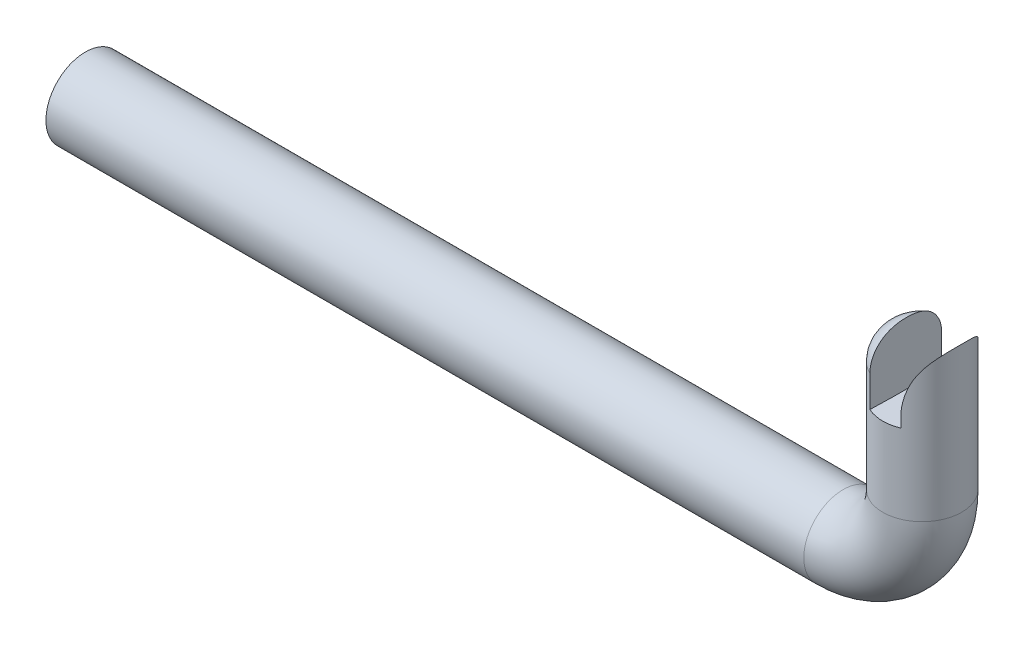
ISO-10303-21;
HEADER;
FILE_DESCRIPTION(('STEP AP214'),'2;1');
FILE_NAME('part.step','',(''),(''),'','','');
FILE_SCHEMA(('AUTOMOTIVE_DESIGN { 1 0 10303 214 1 1 1 1 }'));
ENDSEC;
DATA;
#1=APPLICATION_CONTEXT('core data for automotive mechanical design processes');
#2=APPLICATION_PROTOCOL_DEFINITION('international standard','automotive_design',2000,#1);
#3=PRODUCT_CONTEXT('',#1,'mechanical');
#4=PRODUCT('Part','Part','',(#3));
#5=PRODUCT_RELATED_PRODUCT_CATEGORY('part','',(#4));
#6=PRODUCT_DEFINITION_FORMATION('','',#4);
#7=PRODUCT_DEFINITION_CONTEXT('part definition',#1,'design');
#8=PRODUCT_DEFINITION('design','',#6,#7);
#9=PRODUCT_DEFINITION_SHAPE('','',#8);
#10=(LENGTH_UNIT() NAMED_UNIT(*) SI_UNIT(.MILLI.,.METRE.));
#11=(NAMED_UNIT(*) PLANE_ANGLE_UNIT() SI_UNIT($,.RADIAN.));
#12=(NAMED_UNIT(*) SI_UNIT($,.STERADIAN.) SOLID_ANGLE_UNIT());
#13=UNCERTAINTY_MEASURE_WITH_UNIT(LENGTH_MEASURE(1.E-05),#10,'distance_accuracy_value','');
#14=(GEOMETRIC_REPRESENTATION_CONTEXT(3) GLOBAL_UNCERTAINTY_ASSIGNED_CONTEXT((#13)) GLOBAL_UNIT_ASSIGNED_CONTEXT((#10,
#11,#12)) REPRESENTATION_CONTEXT('',''));
#15=CARTESIAN_POINT('',(0.,0.,0.));
#16=DIRECTION('',(0.,0.,1.));
#17=DIRECTION('',(1.,0.,0.));
#18=AXIS2_PLACEMENT_3D('',#15,#16,#17);
#19=CARTESIAN_POINT('',(67.31,12.7,0.));
#20=DIRECTION('',(0.,1.,0.));
#21=DIRECTION('',(0.,0.,-1.));
#22=AXIS2_PLACEMENT_3D('',#19,#20,#21);
#23=PLANE('',#22);
#24=CARTESIAN_POINT('',(67.31,12.7,0.));
#25=DIRECTION('',(0.,1.,0.));
#26=DIRECTION('',(0.,0.,-1.));
#27=AXIS2_PLACEMENT_3D('',#24,#25,#26);
#28=CIRCLE('',#27,3.175);
#29=CARTESIAN_POINT('',(65.9894886363636,12.7,2.88736467016328));
#30=VERTEX_POINT('',#29);
#31=CARTESIAN_POINT('',(68.5294886363636,12.7,2.93146251311185));
#32=VERTEX_POINT('',#31);
#33=EDGE_CURVE('E89',#30,#32,#28,.T.);
#34=ORIENTED_EDGE('',*,*,#33,.T.);
#35=CARTESIAN_POINT('',(-16.51,12.7,0.));
#36=DIRECTION('',(0.,-1.,0.));
#37=DIRECTION('',(0.,0.,-1.));
#38=AXIS2_PLACEMENT_3D('',#35,#36,#37);
#39=CIRCLE('',#38,85.09);
#40=CARTESIAN_POINT('',(68.5294886363636,12.7,-2.93146251311182));
#41=VERTEX_POINT('',#40);
#42=EDGE_CURVE('E93',#41,#32,#39,.T.);
#43=ORIENTED_EDGE('',*,*,#42,.F.);
#44=CARTESIAN_POINT('',(67.31,12.7,-3.175));
#45=VERTEX_POINT('',#44);
#46=EDGE_CURVE('E79',#41,#45,#28,.T.);
#47=ORIENTED_EDGE('',*,*,#46,.T.);
#48=CARTESIAN_POINT('',(65.9894886363636,12.7,-2.88736467016325));
#49=VERTEX_POINT('',#48);
#50=EDGE_CURVE('E87',#45,#49,#28,.T.);
#51=ORIENTED_EDGE('',*,*,#50,.T.);
#52=CARTESIAN_POINT('',(-16.51,12.7,0.));
#53=DIRECTION('',(0.,1.,0.));
#54=DIRECTION('',(0.,0.,1.));
#55=AXIS2_PLACEMENT_3D('',#52,#53,#54);
#56=CIRCLE('',#55,82.55);
#57=EDGE_CURVE('E109',#30,#49,#56,.T.);
#58=ORIENTED_EDGE('',*,*,#57,.F.);
#59=EDGE_LOOP('',(#34,#43,#47,#51,#58));
#60=FACE_BOUND('',#59,.T.);
#61=ADVANCED_FACE('F34',(#60),#23,.T.);
#62=CARTESIAN_POINT('',(0.,0.,0.));
#63=DIRECTION('',(1.,0.,0.));
#64=DIRECTION('',(0.,0.,-1.));
#65=AXIS2_PLACEMENT_3D('',#62,#63,#64);
#66=PLANE('',#65);
#67=CARTESIAN_POINT('',(0.,0.,0.));
#68=DIRECTION('',(1.,0.,0.));
#69=DIRECTION('',(0.,0.,-1.));
#70=AXIS2_PLACEMENT_3D('',#67,#68,#69);
#71=CIRCLE('',#70,3.175);
#72=CARTESIAN_POINT('',(0.,0.,-3.175));
#73=VERTEX_POINT('',#72);
#74=EDGE_CURVE('E116',#73,#73,#71,.T.);
#75=ORIENTED_EDGE('',*,*,#74,.F.);
#76=EDGE_LOOP('',(#75));
#77=FACE_BOUND('',#76,.T.);
#78=ADVANCED_FACE('F133',(#77),#66,.F.);
#79=CARTESIAN_POINT('',(0.,0.,0.));
#80=DIRECTION('',(1.,0.,0.));
#81=DIRECTION('',(0.,0.,-1.));
#82=AXIS2_PLACEMENT_3D('',#79,#80,#81);
#83=CYLINDRICAL_SURFACE('',#82,3.175);
#84=CARTESIAN_POINT('',(60.96,0.,0.));
#85=DIRECTION('',(1.,0.,0.));
#86=DIRECTION('',(0.,0.,-1.));
#87=AXIS2_PLACEMENT_3D('',#84,#85,#86);
#88=CIRCLE('',#87,3.175);
#89=CARTESIAN_POINT('',(60.96,-3.175,0.));
#90=VERTEX_POINT('',#89);
#91=EDGE_CURVE('E119',#90,#90,#88,.T.);
#92=ORIENTED_EDGE('',*,*,#91,.F.);
#93=EDGE_LOOP('',(#92));
#94=FACE_BOUND('',#93,.T.);
#95=ORIENTED_EDGE('',*,*,#74,.T.);
#96=EDGE_LOOP('',(#95));
#97=FACE_BOUND('',#96,.T.);
#98=ADVANCED_FACE('F135',(#94,#97),#83,.T.);
#99=CARTESIAN_POINT('',(60.96,6.35,0.));
#100=DIRECTION('',(0.,0.,1.));
#101=DIRECTION('',(1.,0.,0.));
#102=AXIS2_PLACEMENT_3D('',#99,#100,#101);
#103=TOROIDAL_SURFACE('',#102,6.35,3.175);
#104=CARTESIAN_POINT('',(67.31,6.35,0.));
#105=DIRECTION('',(0.,1.,0.));
#106=DIRECTION('',(0.,0.,-1.));
#107=AXIS2_PLACEMENT_3D('',#104,#105,#106);
#108=CIRCLE('',#107,3.175);
#109=CARTESIAN_POINT('',(70.485,6.35,0.));
#110=VERTEX_POINT('',#109);
#111=EDGE_CURVE('E90',#110,#110,#108,.T.);
#112=CARTESIAN_POINT('',(60.96,6.35,0.));
#113=DIRECTION('',(0.,0.,1.));
#114=DIRECTION('',(1.,0.,0.));
#115=AXIS2_PLACEMENT_3D('',#112,#113,#114);
#116=CIRCLE('',#115,9.525);
#117=EDGE_CURVE('',#90,#110,#116,.T.);
#118=ORIENTED_EDGE('',*,*,#91,.T.);
#119=ORIENTED_EDGE('',*,*,#111,.F.);
#120=ORIENTED_EDGE('',*,*,#117,.T.);
#121=ORIENTED_EDGE('',*,*,#117,.F.);
#122=EDGE_LOOP('',(#118,#120,#119,#121));
#123=FACE_BOUND('',#122,.T.);
#124=ADVANCED_FACE('F138',(#123),#103,.T.);
#125=CARTESIAN_POINT('',(67.31,6.35,0.));
#126=DIRECTION('',(0.,1.,0.));
#127=DIRECTION('',(0.,0.,1.));
#128=AXIS2_PLACEMENT_3D('',#125,#126,#127);
#129=CYLINDRICAL_SURFACE('',#128,3.175);
#130=DIRECTION('',(0.,-1.,0.));
#131=VECTOR('',#130,1.);
#132=CARTESIAN_POINT('',(65.9894886363636,17.78,2.88736467016325));
#133=LINE('',#132,#131);
#134=CARTESIAN_POINT('',(65.9894886363636,15.24,2.88736467016325));
#135=VERTEX_POINT('',#134);
#136=EDGE_CURVE('E112',#135,#30,#133,.T.);
#137=ORIENTED_EDGE('',*,*,#136,.F.);
#138=CARTESIAN_POINT('',(67.31,15.24,0.));
#139=DIRECTION('',(0.,1.,0.));
#140=DIRECTION('',(0.,0.,1.));
#141=AXIS2_PLACEMENT_3D('',#138,#139,#140);
#142=CIRCLE('',#141,3.175);
#143=CARTESIAN_POINT('',(65.9894886363636,15.24,-2.88736467016325));
#144=VERTEX_POINT('',#143);
#145=EDGE_CURVE('E11',#135,#144,#142,.F.);
#146=ORIENTED_EDGE('',*,*,#145,.T.);
#147=DIRECTION('',(0.,-1.,0.));
#148=VECTOR('',#147,1.);
#149=CARTESIAN_POINT('',(65.9894886363636,17.78,-2.88736467016325));
#150=LINE('',#149,#148);
#151=EDGE_CURVE('E114',#144,#49,#150,.T.);
#152=ORIENTED_EDGE('',*,*,#151,.T.);
#153=ORIENTED_EDGE('',*,*,#50,.F.);
#154=ORIENTED_EDGE('',*,*,#46,.F.);
#155=DIRECTION('',(0.,-1.,0.));
#156=VECTOR('',#155,1.);
#157=CARTESIAN_POINT('',(68.5294886363636,20.2293627722931,-2.93146251311182));
#158=LINE('',#157,#156);
#159=CARTESIAN_POINT('',(68.5294886363648,13.786725544602,-2.93146251311128));
#160=VERTEX_POINT('',#159);
#161=EDGE_CURVE('E85',#160,#41,#158,.T.);
#162=ORIENTED_EDGE('',*,*,#161,.F.);
#163=CARTESIAN_POINT('',(68.5292886363635,13.7841946333267,-2.93154570512459));
#164=CARTESIAN_POINT('',(68.5358704600084,13.8676820542962,-2.92880365594517));
#165=CARTESIAN_POINT('',(68.5439749987798,13.9510193152507,-2.92541197408072));
#166=CARTESIAN_POINT('',(68.5632116640622,14.1172810285871,-2.91722463151394));
#167=CARTESIAN_POINT('',(68.5743440380737,14.2002054466579,-2.91242885603607));
#168=CARTESIAN_POINT('',(68.612291599654,14.4484151419578,-2.89576266692633));
#169=CARTESIAN_POINT('',(68.6436376253025,14.6128887389488,-2.88162089089333));
#170=CARTESIAN_POINT('',(68.7184343887048,14.9400229961957,-2.8458166875618));
#171=CARTESIAN_POINT('',(68.7620063344499,15.1026476000043,-2.82407838936161));
#172=CARTESIAN_POINT('',(68.8604790549763,15.4227822684011,-2.77123942764057));
#173=CARTESIAN_POINT('',(68.9153698092594,15.5802967152072,-2.7401470341656));
#174=CARTESIAN_POINT('',(69.014343571065,15.8344122185945,-2.67916341089952));
#175=CARTESIAN_POINT('',(69.0554632571093,15.9329982439369,-2.65267690475508));
#176=CARTESIAN_POINT('',(69.1415838873913,16.1267275507365,-2.59396332742801));
#177=CARTESIAN_POINT('',(69.1865847997013,16.2218708605049,-2.56173630346547));
#178=CARTESIAN_POINT('',(69.2796867831225,16.4076738744754,-2.4908565931804));
#179=CARTESIAN_POINT('',(69.3277751137669,16.4983495800666,-2.45222939013546));
#180=CARTESIAN_POINT('',(69.4263732636208,16.6748046744267,-2.36765828450857));
#181=CARTESIAN_POINT('',(69.4768824376043,16.7605853546581,-2.3217163240281));
#182=CARTESIAN_POINT('',(69.6070707962979,16.971361699592,-2.1946017760135));
#183=CARTESIAN_POINT('',(69.6877476246288,17.0924657557934,-2.10781590400186));
#184=CARTESIAN_POINT('',(69.8472730733816,17.3174641123781,-1.91276510461582));
#185=CARTESIAN_POINT('',(69.9261231260917,17.4213723170297,-1.80451768790464));
#186=CARTESIAN_POINT('',(70.0629000202454,17.5928188577302,-1.58615205397514));
#187=CARTESIAN_POINT('',(70.1221236981578,17.6635325273664,-1.47935311952978));
#188=CARTESIAN_POINT('',(70.2304756565642,17.7887169983928,-1.25191117738317));
#189=CARTESIAN_POINT('',(70.2796066536578,17.8431921724083,-1.13127190868094));
#190=CARTESIAN_POINT('',(70.3640439833225,17.9347181931388,-0.878238804116461));
#191=CARTESIAN_POINT('',(70.3992823741035,17.9716835812765,-0.745790991423177));
#192=CARTESIAN_POINT('',(70.4525190223221,18.0269014290828,-0.473697167210343));
#193=CARTESIAN_POINT('',(70.4705219694124,18.0451589791283,-0.334053124642608));
#194=CARTESIAN_POINT('',(70.4869415625885,18.0618123431883,-0.0649544282112534));
#195=CARTESIAN_POINT('',(70.4869516283805,18.0618239733429,0.0643073414581022));
#196=CARTESIAN_POINT('',(70.4713553615666,18.046002833576,0.320873795272504));
#197=CARTESIAN_POINT('',(70.4557533835413,18.0301744818124,0.448179015093602));
#198=CARTESIAN_POINT('',(70.4106094404774,17.9834891612171,0.694387719832767));
#199=CARTESIAN_POINT('',(70.381383987031,17.9529729346699,0.813414860641987));
#200=CARTESIAN_POINT('',(70.3111527881743,17.8776441166082,1.04314031356412));
#201=CARTESIAN_POINT('',(70.2701462076783,17.8328305116228,1.15383803455771));
#202=CARTESIAN_POINT('',(70.1768444075482,17.7273290790424,1.36979266295219));
#203=CARTESIAN_POINT('',(70.124100028938,17.6659797309655,1.47452945418606));
#204=CARTESIAN_POINT('',(70.0120567309273,17.529949746619,1.6710252850259));
#205=CARTESIAN_POINT('',(69.9527550344719,17.4552634537931,1.76277878835871));
#206=CARTESIAN_POINT('',(69.8494099230085,17.3186254674866,1.9071874829281));
#207=CARTESIAN_POINT('',(69.8061647720567,17.2596360122688,1.96328389269987));
#208=CARTESIAN_POINT('',(69.7191322527788,17.1365614830395,2.0691547117392));
#209=CARTESIAN_POINT('',(69.675344718323,17.0724748134723,2.11892712867426));
#210=CARTESIAN_POINT('',(69.5880865593967,16.939726314806,2.21247518285372));
#211=CARTESIAN_POINT('',(69.5446164239473,16.8710586152469,2.25624289700168));
#212=CARTESIAN_POINT('',(69.458790418374,16.7297599469638,2.33812805622162));
#213=CARTESIAN_POINT('',(69.4164348814124,16.6571278127413,2.37624382731296));
#214=CARTESIAN_POINT('',(69.3173038003657,16.4794513046804,2.4611222602795));
#215=CARTESIAN_POINT('',(69.2613358628223,16.3727993604036,2.50547211157966));
#216=CARTESIAN_POINT('',(69.1540176160831,16.1540448560229,2.58547985981205));
#217=CARTESIAN_POINT('',(69.1026692530305,16.0419400290751,2.62113410416397));
#218=CARTESIAN_POINT('',(69.0053603025997,15.8130431950198,2.68510277729723));
#219=CARTESIAN_POINT('',(68.9594138284551,15.6962399350608,2.71339820377201));
#220=CARTESIAN_POINT('',(68.8736658387685,15.4590779050553,2.76370130718372));
#221=CARTESIAN_POINT('',(68.8338651577343,15.3387186547965,2.78570813056585));
#222=CARTESIAN_POINT('',(68.7624957071875,15.1007740987251,2.82355025899407));
#223=CARTESIAN_POINT('',(68.730633765529,14.9833135667327,2.83962172934257));
#224=CARTESIAN_POINT('',(68.6731201093552,14.7463979718425,2.86767310831502));
#225=CARTESIAN_POINT('',(68.6474687856733,14.6269427839266,2.87965275946065));
#226=CARTESIAN_POINT('',(68.6027126721131,14.3874694214843,2.90002243558652));
#227=CARTESIAN_POINT('',(68.5835592411735,14.2674625684308,2.90843925403441));
#228=CARTESIAN_POINT('',(68.5516255042211,14.0264651519443,2.92219928084902));
#229=CARTESIAN_POINT('',(68.5388432465092,13.9054749013146,2.92754343055189));
#230=CARTESIAN_POINT('',(68.5292886363636,13.7841946333267,2.93154570512459));
#231=B_SPLINE_CURVE_WITH_KNOTS('',3,(#163,#164,#165,#166,#167,#168,#169,#170,#171,#172,#173,
#174,#175,#176,#177,#178,#179,#180,#181,#182,#183,#184,#185,#186,#187,#188,#189,#190,#191,#192,
#193,#194,#195,#196,#197,#198,#199,#200,#201,#202,#203,#204,#205,#206,#207,#208,#209,#210,#211,
#212,#213,#214,#215,#216,#217,#218,#219,#220,#221,#222,#223,#224,#225,#226,#227,#228,#229,#230),
.UNSPECIFIED.,.F.,.F.,(4,2,2,2,2,2,2,2,2,2,2,2,2,2,2,2,2,2,2,2,2,2,2,2,2,2,2,2,2,2,2,2,2,4),(0.,
0.251339148866503,0.502698848816537,1.00616308265806,1.51480662566067,2.02300178697461,
2.35292598038415,2.68284746004351,3.01148555560074,3.34003654130259,3.84633691921399,
4.35222588969719,4.77379190126482,5.19524429277343,5.61873296214193,6.042106370205,
6.42798449367602,6.81375501630088,7.19097844912591,7.56822862741017,7.96367845222396,
8.35929639800992,8.6354817426416,8.91175388304275,9.18838712383435,9.46510213432789,
9.8495742514857,10.2342075886628,10.6198244988269,11.0054937241058,11.3735297117721,
11.7415888538923,12.1068286797939,12.4719565519094),.UNSPECIFIED.);
#232=CARTESIAN_POINT('',(68.5294886363636,13.7867255446118,2.9314625131118));
#233=VERTEX_POINT('',#232);
#234=EDGE_CURVE('E105',#160,#233,#231,.T.);
#235=ORIENTED_EDGE('',*,*,#234,.T.);
#236=DIRECTION('',(0.,-1.,0.));
#237=VECTOR('',#236,1.);
#238=CARTESIAN_POINT('',(68.5294886363636,20.2293627722931,2.9314625131118));
#239=LINE('',#238,#237);
#240=EDGE_CURVE('E103',#233,#32,#239,.T.);
#241=ORIENTED_EDGE('',*,*,#240,.T.);
#242=ORIENTED_EDGE('',*,*,#33,.F.);
#243=EDGE_LOOP('',(#137,#146,#152,#153,#154,#162,#235,#241,#242));
#244=FACE_BOUND('',#243,.T.);
#245=ORIENTED_EDGE('',*,*,#111,.T.);
#246=EDGE_LOOP('',(#245));
#247=FACE_BOUND('',#246,.T.);
#248=ADVANCED_FACE('F81',(#244,#247),#129,.T.);
#249=CARTESIAN_POINT('',(-16.51,17.78,0.));
#250=DIRECTION('',(0.,-1.,0.));
#251=DIRECTION('',(0.,0.,-1.));
#252=AXIS2_PLACEMENT_3D('',#249,#250,#251);
#253=CYLINDRICAL_SURFACE('',#252,82.55);
#254=ORIENTED_EDGE('',*,*,#151,.F.);
#255=CARTESIAN_POINT('',(65.9894886363636,15.24,-2.88736467016327));
#256=CARTESIAN_POINT('',(65.9894881781337,15.3062450886941,-2.88736449026154));
#257=CARTESIAN_POINT('',(65.9895869171178,15.3724582247644,-2.88455800009493));
#258=CARTESIAN_POINT('',(65.9899777351096,15.5044058101211,-2.87336389797539));
#259=CARTESIAN_POINT('',(65.9902698008079,15.5701402920448,-2.8649766702193));
#260=CARTESIAN_POINT('',(65.9914266515528,15.7657170054363,-2.83154189078236));
#261=CARTESIAN_POINT('',(65.9925721365692,15.8942410105847,-2.79822089538169));
#262=CARTESIAN_POINT('',(65.9955006585344,16.1438500985193,-2.71049151556287));
#263=CARTESIAN_POINT('',(65.997283956979,16.2649321062802,-2.65607448125122));
#264=CARTESIAN_POINT('',(66.0013138042615,16.4963270653641,-2.52778440092875));
#265=CARTESIAN_POINT('',(66.0035603959902,16.6066390182203,-2.45390955337217));
#266=CARTESIAN_POINT('',(66.008314220359,16.8141075974913,-2.28849075411744));
#267=CARTESIAN_POINT('',(66.010822884754,16.911184481989,-2.19684712114976));
#268=CARTESIAN_POINT('',(66.0158531302246,17.0890591806533,-1.9989527403966));
#269=CARTESIAN_POINT('',(66.018374707176,17.1698618961152,-1.8927064067768));
#270=CARTESIAN_POINT('',(66.0221155664556,17.2812667472873,-1.71936299778045));
#271=CARTESIAN_POINT('',(66.0234102315293,17.3180958836614,-1.65616541980675));
#272=CARTESIAN_POINT('',(66.025902815343,17.3863061626219,-1.52689760784841));
#273=CARTESIAN_POINT('',(66.0271007548915,17.4176884786632,-1.46082799645536));
#274=CARTESIAN_POINT('',(66.0293719769188,17.4750361754691,-1.32631219201704));
#275=CARTESIAN_POINT('',(66.0304451366631,17.5009962425203,-1.25786374364018));
#276=CARTESIAN_POINT('',(66.0324417971726,17.5476104438662,-1.11920200846765));
#277=CARTESIAN_POINT('',(66.033365313099,17.5682651158045,-1.04898890129313));
#278=CARTESIAN_POINT('',(66.0354312258626,17.612913805035,-0.874630264580546));
#279=CARTESIAN_POINT('',(66.0364784944611,17.634063523053,-0.769752247836852));
#280=CARTESIAN_POINT('',(66.0381783106433,17.6670319766928,-0.558515210671861));
#281=CARTESIAN_POINT('',(66.0388305314281,17.6788429894354,-0.452155038349568));
#282=CARTESIAN_POINT('',(66.0397249486967,17.6947200471218,-0.23848131789927));
#283=CARTESIAN_POINT('',(66.0399655791627,17.6987565188166,-0.131165683307139));
#284=CARTESIAN_POINT('',(66.0400275316155,17.6998149185097,0.0834705838297441));
#285=CARTESIAN_POINT('',(66.0398489735288,17.6968388527366,0.190791206163311));
#286=CARTESIAN_POINT('',(66.0391358056737,17.6842978646602,0.388430669664968));
#287=CARTESIAN_POINT('',(66.0386604073144,17.6758208499546,0.478816903125977));
#288=CARTESIAN_POINT('',(66.0374203956561,17.6524838433824,0.658769797113479));
#289=CARTESIAN_POINT('',(66.0366558309688,17.637624924318,0.748336592804686));
#290=CARTESIAN_POINT('',(66.0348588386442,17.6006799634354,0.925516558978318));
#291=CARTESIAN_POINT('',(66.0338278082485,17.5786314676555,1.01313740562358));
#292=CARTESIAN_POINT('',(66.0315255632139,17.526627584583,1.18597655545506));
#293=CARTESIAN_POINT('',(66.0302544034679,17.4966740037457,1.27119540262363));
#294=CARTESIAN_POINT('',(66.0267268569955,17.4089422509856,1.48606423758269));
#295=CARTESIAN_POINT('',(66.0243223816335,17.3450426857318,1.61329664607106));
#296=CARTESIAN_POINT('',(66.0192338266745,17.1967548230825,1.85548008964301));
#297=CARTESIAN_POINT('',(66.016549366219,17.1123384039093,1.97041395339785));
#298=CARTESIAN_POINT('',(66.0111700201125,16.9245621018394,2.18414083873859));
#299=CARTESIAN_POINT('',(66.008475124725,16.821158713125,2.28289578475394));
#300=CARTESIAN_POINT('',(66.0033728608365,16.5984256508365,2.46043115670162));
#301=CARTESIAN_POINT('',(66.0009654199335,16.4791000037506,2.53921661804431));
#302=CARTESIAN_POINT('',(65.9968174907292,16.234863727056,2.67051794980471));
#303=CARTESIAN_POINT('',(65.9950486027771,16.1105760820799,2.72419669688823));
#304=CARTESIAN_POINT('',(65.9921900669657,15.8547016749049,2.8094446467256));
#305=CARTESIAN_POINT('',(65.9910995934058,15.7231239987952,2.84104073217418));
#306=CARTESIAN_POINT('',(65.9900994164816,15.5320028595721,2.8698700758268));
#307=CARTESIAN_POINT('',(65.9898706693133,15.4737403825929,2.87643246325353));
#308=CARTESIAN_POINT('',(65.9895653406928,15.3569944466344,2.88517464606925));
#309=CARTESIAN_POINT('',(65.989488481152,15.2985115882908,2.88736245089773));
#310=CARTESIAN_POINT('',(65.9894886363636,15.24,2.88736467016328));
#311=B_SPLINE_CURVE_WITH_KNOTS('',3,(#255,#256,#257,#258,#259,#260,#261,#262,#263,#264,#265,
#266,#267,#268,#269,#270,#271,#272,#273,#274,#275,#276,#277,#278,#279,#280,#281,#282,#283,#284,
#285,#286,#287,#288,#289,#290,#291,#292,#293,#294,#295,#296,#297,#298,#299,#300,#301,#302,#303,
#304,#305,#306,#307,#308,#309,#310),.UNSPECIFIED.,.F.,.F.,(4,2,2,2,2,2,2,2,2,2,2,2,2,2,2,2,2,2,
2,2,2,2,2,2,2,2,2,4),(0.,0.198612383208873,0.397211094684774,0.793494858203022,1.1899412799341,
1.58642442046687,1.98519974965261,2.38385479939483,2.60310250452953,2.82230291647397,
3.04171714360049,3.26110912671822,3.58155955087677,3.90227470328147,4.22420741972468,
4.5460480450783,4.81821188264173,5.09032998718917,5.36104918120525,5.6317065644646,
6.05692426780584,6.4827281229983,6.90952010352446,7.33620435891094,7.74046692803312,
8.14423650014057,8.31999520362072,8.49543181409653),.UNSPECIFIED.);
#312=EDGE_CURVE('E43',#144,#135,#311,.T.);
#313=ORIENTED_EDGE('',*,*,#312,.T.);
#314=ORIENTED_EDGE('',*,*,#136,.T.);
#315=ORIENTED_EDGE('',*,*,#57,.T.);
#316=EDGE_LOOP('',(#254,#313,#314,#315));
#317=FACE_BOUND('',#316,.T.);
#318=ADVANCED_FACE('F128',(#317),#253,.T.);
#319=CARTESIAN_POINT('',(-16.51,20.2293627722931,0.));
#320=DIRECTION('',(0.,-1.,0.));
#321=DIRECTION('',(0.,0.,-1.));
#322=AXIS2_PLACEMENT_3D('',#319,#320,#321);
#323=CYLINDRICAL_SURFACE('',#322,85.09);
#324=ORIENTED_EDGE('',*,*,#240,.F.);
#325=CARTESIAN_POINT('',(-16.5100000000001,13.7867255445856,0.));
#326=DIRECTION('',(0.,-1.,0.));
#327=DIRECTION('',(1.,0.,0.));
#328=AXIS2_PLACEMENT_3D('',#325,#326,#327);
#329=CIRCLE('',#328,85.09);
#330=EDGE_CURVE('E102',#233,#160,#329,.F.);
#331=ORIENTED_EDGE('',*,*,#330,.T.);
#332=ORIENTED_EDGE('',*,*,#161,.T.);
#333=ORIENTED_EDGE('',*,*,#42,.T.);
#334=EDGE_LOOP('',(#324,#331,#332,#333));
#335=FACE_BOUND('',#334,.T.);
#336=ADVANCED_FACE('F101',(#335),#323,.F.);
#337=CARTESIAN_POINT('',(-16.5100000000001,13.2433627722931,0.));
#338=DIRECTION('',(0.,-1.,0.));
#339=DIRECTION('',(-0.880574649347843,0.,0.473907466628163));
#340=AXIS2_PLACEMENT_3D('',#337,#338,#339);
#341=TOROIDAL_SURFACE('',#340,92.0538338505227,6.985);
#342=ORIENTED_EDGE('',*,*,#234,.F.);
#343=ORIENTED_EDGE('',*,*,#330,.F.);
#344=EDGE_LOOP('',(#342,#343));
#345=FACE_BOUND('',#344,.T.);
#346=ADVANCED_FACE('F177',(#345),#341,.T.);
#347=CARTESIAN_POINT('',(67.31,15.24,0.));
#348=DIRECTION('',(0.,1.,0.));
#349=DIRECTION('',(0.,0.,1.));
#350=AXIS2_PLACEMENT_3D('',#347,#348,#349);
#351=DEGENERATE_TOROIDAL_SURFACE('',#350,0.635,2.54,.T.);
#352=ORIENTED_EDGE('',*,*,#312,.F.);
#353=ORIENTED_EDGE('',*,*,#145,.F.);
#354=EDGE_LOOP('',(#352,#353));
#355=FACE_BOUND('',#354,.T.);
#356=ADVANCED_FACE('F36',(#355),#351,.T.);
#357=CLOSED_SHELL('',(#61,#78,#98,#124,#248,#318,#336,#346,#356));
#358=MANIFOLD_SOLID_BREP('B2',#357);
#359=ADVANCED_BREP_SHAPE_REPRESENTATION('',(#18,#358),#14);
#360=SHAPE_DEFINITION_REPRESENTATION(#9,#359);
ENDSEC;
END-ISO-10303-21;
